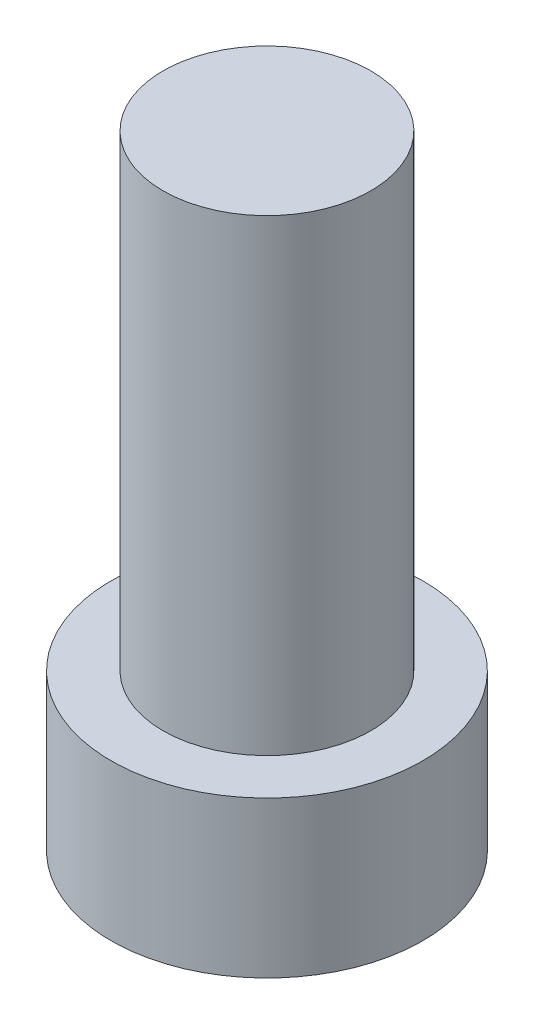
ISO-10303-21;
HEADER;
FILE_DESCRIPTION(('STEP AP214'),'2;1');
FILE_NAME('part.step','',(''),(''),'','','');
FILE_SCHEMA(('AUTOMOTIVE_DESIGN { 1 0 10303 214 1 1 1 1 }'));
ENDSEC;
DATA;
#1=APPLICATION_CONTEXT('core data for automotive mechanical design processes');
#2=APPLICATION_PROTOCOL_DEFINITION('international standard','automotive_design',2000,#1);
#3=PRODUCT_CONTEXT('',#1,'mechanical');
#4=PRODUCT('Part','Part','',(#3));
#5=PRODUCT_RELATED_PRODUCT_CATEGORY('part','',(#4));
#6=PRODUCT_DEFINITION_FORMATION('','',#4);
#7=PRODUCT_DEFINITION_CONTEXT('part definition',#1,'design');
#8=PRODUCT_DEFINITION('design','',#6,#7);
#9=PRODUCT_DEFINITION_SHAPE('','',#8);
#10=(LENGTH_UNIT() NAMED_UNIT(*) SI_UNIT(.MILLI.,.METRE.));
#11=(NAMED_UNIT(*) PLANE_ANGLE_UNIT() SI_UNIT($,.RADIAN.));
#12=(NAMED_UNIT(*) SI_UNIT($,.STERADIAN.) SOLID_ANGLE_UNIT());
#13=UNCERTAINTY_MEASURE_WITH_UNIT(LENGTH_MEASURE(1.E-05),#10,'distance_accuracy_value','');
#14=(GEOMETRIC_REPRESENTATION_CONTEXT(3) GLOBAL_UNCERTAINTY_ASSIGNED_CONTEXT((#13)) GLOBAL_UNIT_ASSIGNED_CONTEXT((#10,
#11,#12)) REPRESENTATION_CONTEXT('',''));
#15=CARTESIAN_POINT('',(0.,0.,0.));
#16=DIRECTION('',(0.,0.,1.));
#17=DIRECTION('',(1.,0.,0.));
#18=AXIS2_PLACEMENT_3D('',#15,#16,#17);
#19=CARTESIAN_POINT('',(0.,0.,0.));
#20=DIRECTION('',(0.,-1.,0.));
#21=DIRECTION('',(0.,0.,-1.));
#22=AXIS2_PLACEMENT_3D('',#19,#20,#21);
#23=PLANE('',#22);
#24=CARTESIAN_POINT('',(0.,0.,0.));
#25=DIRECTION('',(0.,-1.,0.));
#26=DIRECTION('',(0.,0.,-1.));
#27=AXIS2_PLACEMENT_3D('',#24,#25,#26);
#28=CIRCLE('',#27,4.7625);
#29=CARTESIAN_POINT('',(0.,0.,-4.7625));
#30=VERTEX_POINT('',#29);
#31=EDGE_CURVE('E10',#30,#30,#28,.T.);
#32=ORIENTED_EDGE('',*,*,#31,.T.);
#33=EDGE_LOOP('',(#32));
#34=FACE_BOUND('',#33,.T.);
#35=ADVANCED_FACE('F34',(#34),#23,.T.);
#36=CARTESIAN_POINT('',(0.,0.,0.));
#37=DIRECTION('',(0.,-1.,0.));
#38=DIRECTION('',(0.,0.,-1.));
#39=AXIS2_PLACEMENT_3D('',#36,#37,#38);
#40=CYLINDRICAL_SURFACE('',#39,4.7625);
#41=CARTESIAN_POINT('',(0.,4.7625,0.));
#42=DIRECTION('',(0.,-1.,0.));
#43=DIRECTION('',(0.,0.,-1.));
#44=AXIS2_PLACEMENT_3D('',#41,#42,#43);
#45=CIRCLE('',#44,4.7625);
#46=CARTESIAN_POINT('',(0.,4.7625,-4.7625));
#47=VERTEX_POINT('',#46);
#48=EDGE_CURVE('E40',#47,#47,#45,.T.);
#49=ORIENTED_EDGE('',*,*,#48,.T.);
#50=EDGE_LOOP('',(#49));
#51=FACE_BOUND('',#50,.T.);
#52=ORIENTED_EDGE('',*,*,#31,.F.);
#53=EDGE_LOOP('',(#52));
#54=FACE_BOUND('',#53,.T.);
#55=ADVANCED_FACE('F66',(#51,#54),#40,.T.);
#56=CARTESIAN_POINT('',(4.7625,4.7625,0.));
#57=DIRECTION('',(0.,1.,0.));
#58=DIRECTION('',(0.,0.,1.));
#59=AXIS2_PLACEMENT_3D('',#56,#57,#58);
#60=PLANE('',#59);
#61=CARTESIAN_POINT('',(0.,4.7625,0.));
#62=DIRECTION('',(0.,-1.,0.));
#63=DIRECTION('',(0.,0.,-1.));
#64=AXIS2_PLACEMENT_3D('',#61,#62,#63);
#65=CIRCLE('',#64,3.175);
#66=CARTESIAN_POINT('',(0.,4.7625,-3.175));
#67=VERTEX_POINT('',#66);
#68=EDGE_CURVE('E44',#67,#67,#65,.T.);
#69=ORIENTED_EDGE('',*,*,#68,.T.);
#70=EDGE_LOOP('',(#69));
#71=FACE_BOUND('',#70,.T.);
#72=ORIENTED_EDGE('',*,*,#48,.F.);
#73=EDGE_LOOP('',(#72));
#74=FACE_BOUND('',#73,.T.);
#75=ADVANCED_FACE('F63',(#71,#74),#60,.T.);
#76=CARTESIAN_POINT('',(0.,0.,0.));
#77=DIRECTION('',(0.,-1.,0.));
#78=DIRECTION('',(0.,0.,-1.));
#79=AXIS2_PLACEMENT_3D('',#76,#77,#78);
#80=CYLINDRICAL_SURFACE('',#79,3.175);
#81=CARTESIAN_POINT('',(0.,19.05,0.));
#82=DIRECTION('',(0.,-1.,0.));
#83=DIRECTION('',(0.,0.,-1.));
#84=AXIS2_PLACEMENT_3D('',#81,#82,#83);
#85=CIRCLE('',#84,3.175);
#86=CARTESIAN_POINT('',(0.,19.05,-3.175));
#87=VERTEX_POINT('',#86);
#88=EDGE_CURVE('E48',#87,#87,#85,.T.);
#89=ORIENTED_EDGE('',*,*,#88,.T.);
#90=EDGE_LOOP('',(#89));
#91=FACE_BOUND('',#90,.T.);
#92=ORIENTED_EDGE('',*,*,#68,.F.);
#93=EDGE_LOOP('',(#92));
#94=FACE_BOUND('',#93,.T.);
#95=ADVANCED_FACE('F54',(#91,#94),#80,.T.);
#96=CARTESIAN_POINT('',(3.175,19.05,0.));
#97=DIRECTION('',(0.,1.,0.));
#98=DIRECTION('',(0.,0.,1.));
#99=AXIS2_PLACEMENT_3D('',#96,#97,#98);
#100=PLANE('',#99);
#101=ORIENTED_EDGE('',*,*,#88,.F.);
#102=EDGE_LOOP('',(#101));
#103=FACE_BOUND('',#102,.T.);
#104=ADVANCED_FACE('F57',(#103),#100,.T.);
#105=CLOSED_SHELL('',(#35,#55,#75,#95,#104));
#106=MANIFOLD_SOLID_BREP('B2',#105);
#107=ADVANCED_BREP_SHAPE_REPRESENTATION('',(#18,#106),#14);
#108=SHAPE_DEFINITION_REPRESENTATION(#9,#107);
ENDSEC;
END-ISO-10303-21;
